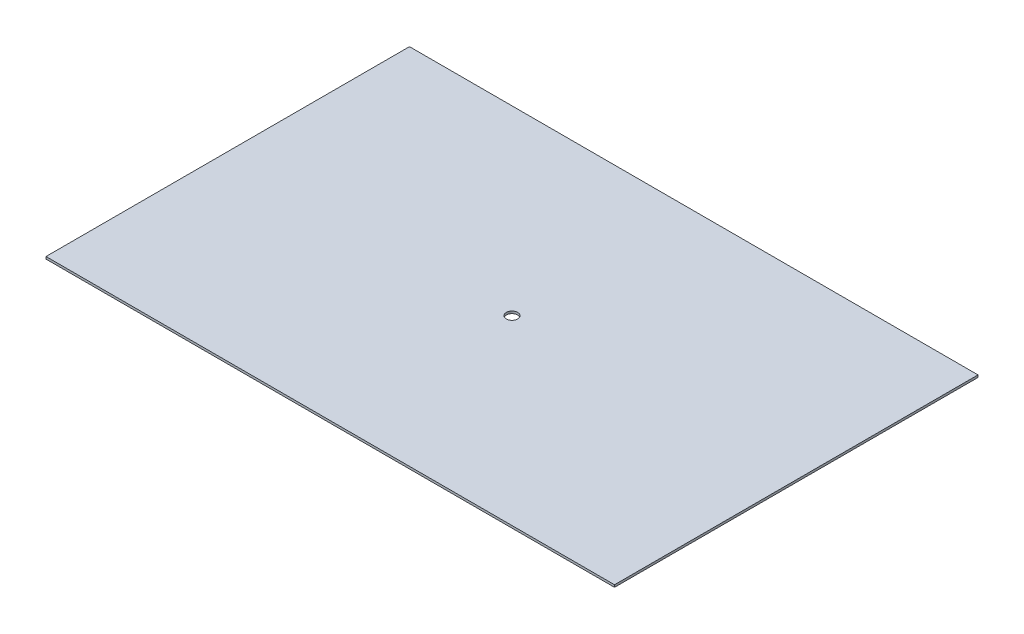
ISO-10303-21;
HEADER;
FILE_DESCRIPTION(('STEP AP214'),'2;1');
FILE_NAME('part.step','',(''),(''),'','','');
FILE_SCHEMA(('AUTOMOTIVE_DESIGN { 1 0 10303 214 1 1 1 1 }'));
ENDSEC;
DATA;
#1=APPLICATION_CONTEXT('core data for automotive mechanical design processes');
#2=APPLICATION_PROTOCOL_DEFINITION('international standard','automotive_design',2000,#1);
#3=PRODUCT_CONTEXT('',#1,'mechanical');
#4=PRODUCT('Part','Part','',(#3));
#5=PRODUCT_RELATED_PRODUCT_CATEGORY('part','',(#4));
#6=PRODUCT_DEFINITION_FORMATION('','',#4);
#7=PRODUCT_DEFINITION_CONTEXT('part definition',#1,'design');
#8=PRODUCT_DEFINITION('design','',#6,#7);
#9=PRODUCT_DEFINITION_SHAPE('','',#8);
#10=(LENGTH_UNIT() NAMED_UNIT(*) SI_UNIT(.MILLI.,.METRE.));
#11=(NAMED_UNIT(*) PLANE_ANGLE_UNIT() SI_UNIT($,.RADIAN.));
#12=(NAMED_UNIT(*) SI_UNIT($,.STERADIAN.) SOLID_ANGLE_UNIT());
#13=UNCERTAINTY_MEASURE_WITH_UNIT(LENGTH_MEASURE(1.E-05),#10,'distance_accuracy_value','');
#14=(GEOMETRIC_REPRESENTATION_CONTEXT(3) GLOBAL_UNCERTAINTY_ASSIGNED_CONTEXT((#13)) GLOBAL_UNIT_ASSIGNED_CONTEXT((#10,
#11,#12)) REPRESENTATION_CONTEXT('',''));
#15=CARTESIAN_POINT('',(0.,0.,0.));
#16=DIRECTION('',(0.,0.,1.));
#17=DIRECTION('',(1.,0.,0.));
#18=AXIS2_PLACEMENT_3D('',#15,#16,#17);
#19=CARTESIAN_POINT('',(0.,1.,0.));
#20=DIRECTION('',(0.,-1.,0.));
#21=DIRECTION('',(0.,0.,-1.));
#22=AXIS2_PLACEMENT_3D('',#19,#20,#21);
#23=PLANE('',#22);
#24=DIRECTION('',(0.,0.,-1.));
#25=VECTOR('',#24,1.);
#26=CARTESIAN_POINT('',(124.7625,1.,79.7625));
#27=LINE('',#26,#25);
#28=CARTESIAN_POINT('',(124.7625,1.,79.7625));
#29=VERTEX_POINT('',#28);
#30=CARTESIAN_POINT('',(124.7625,1.,-79.7625));
#31=VERTEX_POINT('',#30);
#32=EDGE_CURVE('E91',#29,#31,#27,.T.);
#33=ORIENTED_EDGE('',*,*,#32,.T.);
#34=DIRECTION('',(-1.,0.,0.));
#35=VECTOR('',#34,1.);
#36=CARTESIAN_POINT('',(-124.7625,1.,-79.7625));
#37=LINE('',#36,#35);
#38=CARTESIAN_POINT('',(-124.7625,1.,-79.7625));
#39=VERTEX_POINT('',#38);
#40=EDGE_CURVE('E86',#31,#39,#37,.T.);
#41=ORIENTED_EDGE('',*,*,#40,.T.);
#42=DIRECTION('',(0.,0.,1.));
#43=VECTOR('',#42,1.);
#44=CARTESIAN_POINT('',(-124.7625,1.,79.7625));
#45=LINE('',#44,#43);
#46=CARTESIAN_POINT('',(-124.7625,1.,79.7625));
#47=VERTEX_POINT('',#46);
#48=EDGE_CURVE('E89',#39,#47,#45,.T.);
#49=ORIENTED_EDGE('',*,*,#48,.T.);
#50=DIRECTION('',(1.,0.,0.));
#51=VECTOR('',#50,1.);
#52=CARTESIAN_POINT('',(-124.7625,1.,79.7625));
#53=LINE('',#52,#51);
#54=EDGE_CURVE('E56',#47,#29,#53,.T.);
#55=ORIENTED_EDGE('',*,*,#54,.T.);
#56=EDGE_LOOP('',(#33,#41,#49,#55));
#57=FACE_BOUND('',#56,.T.);
#58=CARTESIAN_POINT('',(0.,1.,0.));
#59=DIRECTION('',(0.,1.,0.));
#60=DIRECTION('',(0.,0.,1.));
#61=AXIS2_PLACEMENT_3D('',#58,#59,#60);
#62=CIRCLE('',#61,2.5);
#63=CARTESIAN_POINT('',(0.,1.,2.50000000000003));
#64=VERTEX_POINT('',#63);
#65=EDGE_CURVE('E106',#64,#64,#62,.T.);
#66=ORIENTED_EDGE('',*,*,#65,.F.);
#67=EDGE_LOOP('',(#66));
#68=FACE_BOUND('',#67,.T.);
#69=ADVANCED_FACE('F39',(#57,#68),#23,.F.);
#70=CARTESIAN_POINT('',(0.,0.,0.));
#71=DIRECTION('',(0.,-1.,0.));
#72=DIRECTION('',(0.,0.,-1.));
#73=AXIS2_PLACEMENT_3D('',#70,#71,#72);
#74=PLANE('',#73);
#75=DIRECTION('',(0.,0.,-1.));
#76=VECTOR('',#75,1.);
#77=CARTESIAN_POINT('',(124.7625,0.,79.7625));
#78=LINE('',#77,#76);
#79=CARTESIAN_POINT('',(124.7625,0.,79.7625));
#80=VERTEX_POINT('',#79);
#81=CARTESIAN_POINT('',(124.7625,0.,-79.7625));
#82=VERTEX_POINT('',#81);
#83=EDGE_CURVE('E103',#80,#82,#78,.T.);
#84=ORIENTED_EDGE('',*,*,#83,.F.);
#85=DIRECTION('',(1.,0.,0.));
#86=VECTOR('',#85,1.);
#87=CARTESIAN_POINT('',(-124.7625,0.,79.7625));
#88=LINE('',#87,#86);
#89=CARTESIAN_POINT('',(-124.7625,0.,79.7625));
#90=VERTEX_POINT('',#89);
#91=EDGE_CURVE('E79',#90,#80,#88,.T.);
#92=ORIENTED_EDGE('',*,*,#91,.F.);
#93=DIRECTION('',(0.,0.,1.));
#94=VECTOR('',#93,1.);
#95=CARTESIAN_POINT('',(-124.7625,0.,79.7625));
#96=LINE('',#95,#94);
#97=CARTESIAN_POINT('',(-124.7625,0.,-79.7625));
#98=VERTEX_POINT('',#97);
#99=EDGE_CURVE('E73',#98,#90,#96,.T.);
#100=ORIENTED_EDGE('',*,*,#99,.F.);
#101=DIRECTION('',(-1.,0.,0.));
#102=VECTOR('',#101,1.);
#103=CARTESIAN_POINT('',(-124.7625,0.,-79.7625));
#104=LINE('',#103,#102);
#105=EDGE_CURVE('E95',#82,#98,#104,.T.);
#106=ORIENTED_EDGE('',*,*,#105,.F.);
#107=EDGE_LOOP('',(#84,#92,#100,#106));
#108=FACE_BOUND('',#107,.T.);
#109=CARTESIAN_POINT('',(0.,0.,0.));
#110=DIRECTION('',(0.,1.,0.));
#111=DIRECTION('',(0.,0.,1.));
#112=AXIS2_PLACEMENT_3D('',#109,#110,#111);
#113=CIRCLE('',#112,2.5);
#114=CARTESIAN_POINT('',(0.,0.,2.50000000000003));
#115=VERTEX_POINT('',#114);
#116=EDGE_CURVE('E118',#115,#115,#113,.T.);
#117=ORIENTED_EDGE('',*,*,#116,.T.);
#118=EDGE_LOOP('',(#117));
#119=FACE_BOUND('',#118,.T.);
#120=ADVANCED_FACE('F114',(#108,#119),#74,.T.);
#121=CARTESIAN_POINT('',(124.7625,1.,79.7625));
#122=DIRECTION('',(-1.,0.,0.));
#123=DIRECTION('',(0.,0.,1.));
#124=AXIS2_PLACEMENT_3D('',#121,#122,#123);
#125=PLANE('',#124);
#126=ORIENTED_EDGE('',*,*,#83,.T.);
#127=DIRECTION('',(0.,-1.,0.));
#128=VECTOR('',#127,1.);
#129=CARTESIAN_POINT('',(124.7625,1.,-79.7625));
#130=LINE('',#129,#128);
#131=EDGE_CURVE('E11',#31,#82,#130,.T.);
#132=ORIENTED_EDGE('',*,*,#131,.F.);
#133=ORIENTED_EDGE('',*,*,#32,.F.);
#134=DIRECTION('',(0.,-1.,0.));
#135=VECTOR('',#134,1.);
#136=CARTESIAN_POINT('',(124.7625,1.,79.7625));
#137=LINE('',#136,#135);
#138=EDGE_CURVE('E99',#29,#80,#137,.T.);
#139=ORIENTED_EDGE('',*,*,#138,.T.);
#140=EDGE_LOOP('',(#126,#132,#133,#139));
#141=FACE_BOUND('',#140,.T.);
#142=ADVANCED_FACE('F41',(#141),#125,.F.);
#143=CARTESIAN_POINT('',(-124.7625,1.,-79.7625));
#144=DIRECTION('',(0.,0.,1.));
#145=DIRECTION('',(1.,0.,0.));
#146=AXIS2_PLACEMENT_3D('',#143,#144,#145);
#147=PLANE('',#146);
#148=ORIENTED_EDGE('',*,*,#105,.T.);
#149=DIRECTION('',(0.,-1.,0.));
#150=VECTOR('',#149,1.);
#151=CARTESIAN_POINT('',(-124.7625,1.,-79.7625));
#152=LINE('',#151,#150);
#153=EDGE_CURVE('E48',#39,#98,#152,.T.);
#154=ORIENTED_EDGE('',*,*,#153,.F.);
#155=ORIENTED_EDGE('',*,*,#40,.F.);
#156=ORIENTED_EDGE('',*,*,#131,.T.);
#157=EDGE_LOOP('',(#148,#154,#155,#156));
#158=FACE_BOUND('',#157,.T.);
#159=ADVANCED_FACE('F94',(#158),#147,.F.);
#160=CARTESIAN_POINT('',(-124.7625,1.,79.7625));
#161=DIRECTION('',(1.,0.,0.));
#162=DIRECTION('',(0.,0.,-1.));
#163=AXIS2_PLACEMENT_3D('',#160,#161,#162);
#164=PLANE('',#163);
#165=ORIENTED_EDGE('',*,*,#99,.T.);
#166=DIRECTION('',(0.,-1.,0.));
#167=VECTOR('',#166,1.);
#168=CARTESIAN_POINT('',(-124.7625,1.,79.7625));
#169=LINE('',#168,#167);
#170=EDGE_CURVE('E96',#47,#90,#169,.T.);
#171=ORIENTED_EDGE('',*,*,#170,.F.);
#172=ORIENTED_EDGE('',*,*,#48,.F.);
#173=ORIENTED_EDGE('',*,*,#153,.T.);
#174=EDGE_LOOP('',(#165,#171,#172,#173));
#175=FACE_BOUND('',#174,.T.);
#176=ADVANCED_FACE('F97',(#175),#164,.F.);
#177=CARTESIAN_POINT('',(-124.7625,1.,79.7625));
#178=DIRECTION('',(0.,0.,-1.));
#179=DIRECTION('',(-1.,0.,0.));
#180=AXIS2_PLACEMENT_3D('',#177,#178,#179);
#181=PLANE('',#180);
#182=ORIENTED_EDGE('',*,*,#91,.T.);
#183=ORIENTED_EDGE('',*,*,#138,.F.);
#184=ORIENTED_EDGE('',*,*,#54,.F.);
#185=ORIENTED_EDGE('',*,*,#170,.T.);
#186=EDGE_LOOP('',(#182,#183,#184,#185));
#187=FACE_BOUND('',#186,.T.);
#188=ADVANCED_FACE('F111',(#187),#181,.F.);
#189=CARTESIAN_POINT('',(0.,1.,0.));
#190=DIRECTION('',(0.,-1.,0.));
#191=DIRECTION('',(0.,0.,-1.));
#192=AXIS2_PLACEMENT_3D('',#189,#190,#191);
#193=CYLINDRICAL_SURFACE('',#192,2.5);
#194=ORIENTED_EDGE('',*,*,#65,.T.);
#195=EDGE_LOOP('',(#194));
#196=FACE_BOUND('',#195,.T.);
#197=ORIENTED_EDGE('',*,*,#116,.F.);
#198=EDGE_LOOP('',(#197));
#199=FACE_BOUND('',#198,.T.);
#200=ADVANCED_FACE('F124',(#196,#199),#193,.F.);
#201=CLOSED_SHELL('',(#69,#120,#142,#159,#176,#188,#200));
#202=MANIFOLD_SOLID_BREP('B2',#201);
#203=ADVANCED_BREP_SHAPE_REPRESENTATION('',(#18,#202),#14);
#204=SHAPE_DEFINITION_REPRESENTATION(#9,#203);
ENDSEC;
END-ISO-10303-21;
